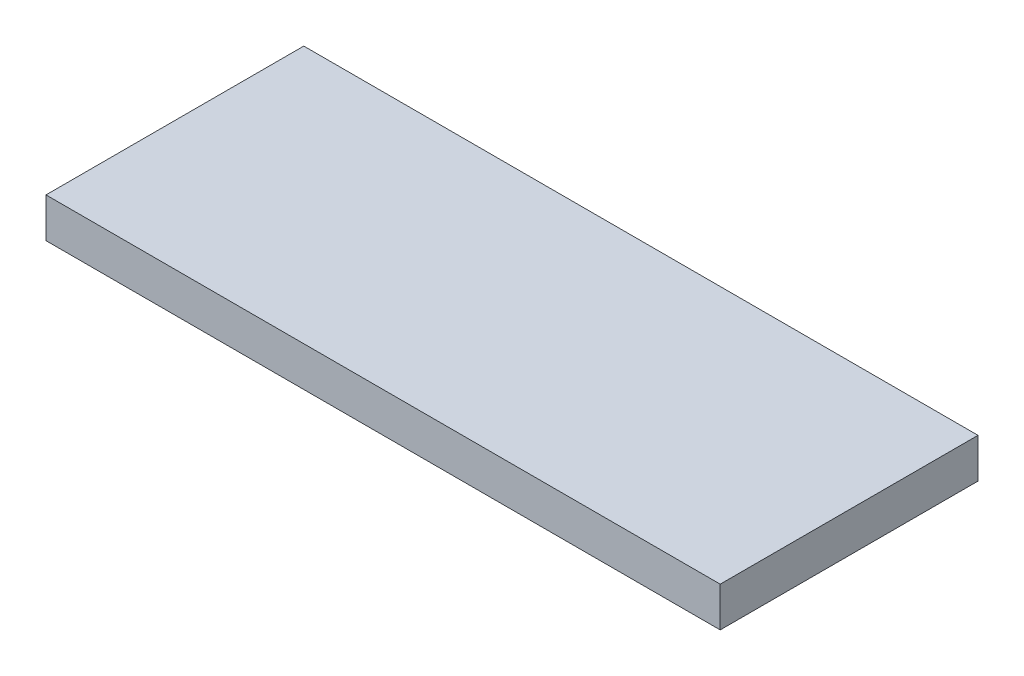
ISO-10303-21;
HEADER;
FILE_DESCRIPTION(('STEP AP214'),'2;1');
FILE_NAME('part.step','',(''),(''),'','','');
FILE_SCHEMA(('AUTOMOTIVE_DESIGN { 1 0 10303 214 1 1 1 1 }'));
ENDSEC;
DATA;
#1=APPLICATION_CONTEXT('core data for automotive mechanical design processes');
#2=APPLICATION_PROTOCOL_DEFINITION('international standard','automotive_design',2000,#1);
#3=PRODUCT_CONTEXT('',#1,'mechanical');
#4=PRODUCT('Part','Part','',(#3));
#5=PRODUCT_RELATED_PRODUCT_CATEGORY('part','',(#4));
#6=PRODUCT_DEFINITION_FORMATION('','',#4);
#7=PRODUCT_DEFINITION_CONTEXT('part definition',#1,'design');
#8=PRODUCT_DEFINITION('design','',#6,#7);
#9=PRODUCT_DEFINITION_SHAPE('','',#8);
#10=(LENGTH_UNIT() NAMED_UNIT(*) SI_UNIT(.MILLI.,.METRE.));
#11=(NAMED_UNIT(*) PLANE_ANGLE_UNIT() SI_UNIT($,.RADIAN.));
#12=(NAMED_UNIT(*) SI_UNIT($,.STERADIAN.) SOLID_ANGLE_UNIT());
#13=UNCERTAINTY_MEASURE_WITH_UNIT(LENGTH_MEASURE(1.E-05),#10,'distance_accuracy_value','');
#14=(GEOMETRIC_REPRESENTATION_CONTEXT(3) GLOBAL_UNCERTAINTY_ASSIGNED_CONTEXT((#13)) GLOBAL_UNIT_ASSIGNED_CONTEXT((#10,
#11,#12)) REPRESENTATION_CONTEXT('',''));
#15=CARTESIAN_POINT('',(0.,0.,0.));
#16=DIRECTION('',(0.,0.,1.));
#17=DIRECTION('',(1.,0.,0.));
#18=AXIS2_PLACEMENT_3D('',#15,#16,#17);
#19=CARTESIAN_POINT('',(85.,10.,-32.5));
#20=DIRECTION('',(-1.,0.,0.));
#21=DIRECTION('',(0.,0.,1.));
#22=AXIS2_PLACEMENT_3D('',#19,#20,#21);
#23=PLANE('',#22);
#24=DIRECTION('',(0.,0.,-1.));
#25=VECTOR('',#24,1.);
#26=CARTESIAN_POINT('',(85.,0.,-32.5));
#27=LINE('',#26,#25);
#28=CARTESIAN_POINT('',(85.,0.,32.5));
#29=VERTEX_POINT('',#28);
#30=CARTESIAN_POINT('',(85.,0.,-32.5));
#31=VERTEX_POINT('',#30);
#32=EDGE_CURVE('E280',#29,#31,#27,.T.);
#33=ORIENTED_EDGE('',*,*,#32,.T.);
#34=DIRECTION('',(0.,-1.,0.));
#35=VECTOR('',#34,1.);
#36=CARTESIAN_POINT('',(85.,10.,-32.5));
#37=LINE('',#36,#35);
#38=CARTESIAN_POINT('',(85.,10.,-32.5));
#39=VERTEX_POINT('',#38);
#40=EDGE_CURVE('E11',#39,#31,#37,.T.);
#41=ORIENTED_EDGE('',*,*,#40,.F.);
#42=DIRECTION('',(0.,0.,-1.));
#43=VECTOR('',#42,1.);
#44=CARTESIAN_POINT('',(85.,10.,-32.5));
#45=LINE('',#44,#43);
#46=CARTESIAN_POINT('',(85.,10.,32.5));
#47=VERTEX_POINT('',#46);
#48=EDGE_CURVE('E501',#47,#39,#45,.T.);
#49=ORIENTED_EDGE('',*,*,#48,.F.);
#50=DIRECTION('',(0.,-1.,0.));
#51=VECTOR('',#50,1.);
#52=CARTESIAN_POINT('',(85.,10.,32.5));
#53=LINE('',#52,#51);
#54=EDGE_CURVE('E511',#47,#29,#53,.T.);
#55=ORIENTED_EDGE('',*,*,#54,.T.);
#56=EDGE_LOOP('',(#33,#41,#49,#55));
#57=FACE_BOUND('',#56,.T.);
#58=ADVANCED_FACE('F50',(#57),#23,.F.);
#59=CARTESIAN_POINT('',(-85.,10.,-32.5));
#60=DIRECTION('',(0.,0.,1.));
#61=DIRECTION('',(1.,0.,0.));
#62=AXIS2_PLACEMENT_3D('',#59,#60,#61);
#63=PLANE('',#62);
#64=DIRECTION('',(1.,0.,0.));
#65=VECTOR('',#64,1.);
#66=CARTESIAN_POINT('',(-73.1490114378295,5.88872544908327,-32.5));
#67=LINE('',#66,#65);
#68=CARTESIAN_POINT('',(-73.1490114378295,5.88872544908327,-32.5));
#69=VERTEX_POINT('',#68);
#70=CARTESIAN_POINT('',(-62.2916738910824,5.88872544908327,-32.5));
#71=VERTEX_POINT('',#70);
#72=EDGE_CURVE('E268',#69,#71,#67,.T.);
#73=ORIENTED_EDGE('',*,*,#72,.F.);
#74=DIRECTION('',(0.,1.,0.));
#75=VECTOR('',#74,1.);
#76=CARTESIAN_POINT('',(-73.1490114378295,2.57631738397402,-32.5));
#77=LINE('',#76,#75);
#78=CARTESIAN_POINT('',(-73.1490114378295,2.57631738397402,-32.5));
#79=VERTEX_POINT('',#78);
#80=EDGE_CURVE('E65',#79,#69,#77,.T.);
#81=ORIENTED_EDGE('',*,*,#80,.F.);
#82=DIRECTION('',(-1.,0.,0.));
#83=VECTOR('',#82,1.);
#84=CARTESIAN_POINT('',(-73.1490114378295,2.57631738397402,-32.5));
#85=LINE('',#84,#83);
#86=CARTESIAN_POINT('',(-62.2916738910824,2.57631738397402,-32.5));
#87=VERTEX_POINT('',#86);
#88=EDGE_CURVE('E251',#87,#79,#85,.T.);
#89=ORIENTED_EDGE('',*,*,#88,.F.);
#90=DIRECTION('',(0.,-1.,0.));
#91=VECTOR('',#90,1.);
#92=CARTESIAN_POINT('',(-62.2916738910824,2.57631738397402,-32.5));
#93=LINE('',#92,#91);
#94=EDGE_CURVE('E260',#71,#87,#93,.T.);
#95=ORIENTED_EDGE('',*,*,#94,.F.);
#96=EDGE_LOOP('',(#73,#81,#89,#95));
#97=FACE_BOUND('',#96,.T.);
#98=DIRECTION('',(1.,0.,0.));
#99=VECTOR('',#98,1.);
#100=CARTESIAN_POINT('',(-57.5070844637024,5.88872544908327,-32.5));
#101=LINE('',#100,#99);
#102=CARTESIAN_POINT('',(-57.5070844637024,5.88872544908327,-32.5));
#103=VERTEX_POINT('',#102);
#104=CARTESIAN_POINT('',(-44.9935428844007,5.88872544908327,-32.5));
#105=VERTEX_POINT('',#104);
#106=EDGE_CURVE('E308',#103,#105,#101,.T.);
#107=ORIENTED_EDGE('',*,*,#106,.F.);
#108=DIRECTION('',(0.,1.,0.));
#109=VECTOR('',#108,1.);
#110=CARTESIAN_POINT('',(-57.5070844637024,2.57631738397402,-32.5));
#111=LINE('',#110,#109);
#112=CARTESIAN_POINT('',(-57.5070844637024,2.57631738397402,-32.5));
#113=VERTEX_POINT('',#112);
#114=EDGE_CURVE('E68',#113,#103,#111,.T.);
#115=ORIENTED_EDGE('',*,*,#114,.F.);
#116=DIRECTION('',(-1.,0.,0.));
#117=VECTOR('',#116,1.);
#118=CARTESIAN_POINT('',(-57.5070844637024,2.57631738397402,-32.5));
#119=LINE('',#118,#117);
#120=CARTESIAN_POINT('',(-44.9935428844007,2.57631738397402,-32.5));
#121=VERTEX_POINT('',#120);
#122=EDGE_CURVE('E300',#121,#113,#119,.T.);
#123=ORIENTED_EDGE('',*,*,#122,.F.);
#124=DIRECTION('',(0.,-1.,0.));
#125=VECTOR('',#124,1.);
#126=CARTESIAN_POINT('',(-44.9935428844007,2.57631738397402,-32.5));
#127=LINE('',#126,#125);
#128=EDGE_CURVE('E303',#105,#121,#127,.T.);
#129=ORIENTED_EDGE('',*,*,#128,.F.);
#130=EDGE_LOOP('',(#107,#115,#123,#129));
#131=FACE_BOUND('',#130,.T.);
#132=DIRECTION('',(1.,0.,0.));
#133=VECTOR('',#132,1.);
#134=CARTESIAN_POINT('',(-30.8237972725445,7.9129748222056,-32.5));
#135=LINE('',#134,#133);
#136=CARTESIAN_POINT('',(-30.8237972725445,7.9129748222056,-32.5));
#137=VERTEX_POINT('',#136);
#138=CARTESIAN_POINT('',(-17.5741650121075,7.9129748222056,-32.5));
#139=VERTEX_POINT('',#138);
#140=EDGE_CURVE('E349',#137,#139,#135,.T.);
#141=ORIENTED_EDGE('',*,*,#140,.F.);
#142=DIRECTION('',(0.,1.,0.));
#143=VECTOR('',#142,1.);
#144=CARTESIAN_POINT('',(-30.8237972725445,2.57631738397402,-32.5));
#145=LINE('',#144,#143);
#146=CARTESIAN_POINT('',(-30.8237972725445,2.57631738397402,-32.5));
#147=VERTEX_POINT('',#146);
#148=EDGE_CURVE('E297',#147,#137,#145,.T.);
#149=ORIENTED_EDGE('',*,*,#148,.F.);
#150=DIRECTION('',(-1.,0.,0.));
#151=VECTOR('',#150,1.);
#152=CARTESIAN_POINT('',(-30.8237972725445,2.57631738397402,-32.5));
#153=LINE('',#152,#151);
#154=CARTESIAN_POINT('',(-17.5741650121075,2.57631738397402,-32.5));
#155=VERTEX_POINT('',#154);
#156=EDGE_CURVE('E342',#155,#147,#153,.T.);
#157=ORIENTED_EDGE('',*,*,#156,.F.);
#158=DIRECTION('',(0.,-1.,0.));
#159=VECTOR('',#158,1.);
#160=CARTESIAN_POINT('',(-17.5741650121075,2.57631738397402,-32.5));
#161=LINE('',#160,#159);
#162=EDGE_CURVE('E341',#139,#155,#161,.T.);
#163=ORIENTED_EDGE('',*,*,#162,.F.);
#164=EDGE_LOOP('',(#141,#149,#157,#163));
#165=FACE_BOUND('',#164,.T.);
#166=DIRECTION('',(1.,0.,0.));
#167=VECTOR('',#166,1.);
#168=CARTESIAN_POINT('',(-9.10912217905047,7.9129748222056,-32.5));
#169=LINE('',#168,#167);
#170=CARTESIAN_POINT('',(-9.10912217905047,7.9129748222056,-32.5));
#171=VERTEX_POINT('',#170);
#172=CARTESIAN_POINT('',(5.24464610308967,7.9129748222056,-32.5));
#173=VERTEX_POINT('',#172);
#174=EDGE_CURVE('E395',#171,#173,#169,.T.);
#175=ORIENTED_EDGE('',*,*,#174,.F.);
#176=DIRECTION('',(0.,1.,0.));
#177=VECTOR('',#176,1.);
#178=CARTESIAN_POINT('',(-9.10912217905047,2.57631738397402,-32.5));
#179=LINE('',#178,#177);
#180=CARTESIAN_POINT('',(-9.10912217905047,2.57631738397402,-32.5));
#181=VERTEX_POINT('',#180);
#182=EDGE_CURVE('E338',#181,#171,#179,.T.);
#183=ORIENTED_EDGE('',*,*,#182,.F.);
#184=DIRECTION('',(-1.,0.,0.));
#185=VECTOR('',#184,1.);
#186=CARTESIAN_POINT('',(-9.10912217905047,2.57631738397402,-32.5));
#187=LINE('',#186,#185);
#188=CARTESIAN_POINT('',(5.24464610308967,2.57631738397402,-32.5));
#189=VERTEX_POINT('',#188);
#190=EDGE_CURVE('E383',#189,#181,#187,.T.);
#191=ORIENTED_EDGE('',*,*,#190,.F.);
#192=DIRECTION('',(0.,-1.,0.));
#193=VECTOR('',#192,1.);
#194=CARTESIAN_POINT('',(5.24464610308967,2.57631738397402,-32.5));
#195=LINE('',#194,#193);
#196=EDGE_CURVE('E389',#173,#189,#195,.T.);
#197=ORIENTED_EDGE('',*,*,#196,.F.);
#198=EDGE_LOOP('',(#175,#183,#191,#197));
#199=FACE_BOUND('',#198,.T.);
#200=DIRECTION('',(1.,0.,0.));
#201=VECTOR('',#200,1.);
#202=CARTESIAN_POINT('',(14.8138249578497,7.9129748222056,-32.5));
#203=LINE('',#202,#201);
#204=CARTESIAN_POINT('',(14.8138249578497,7.9129748222056,-32.5));
#205=VERTEX_POINT('',#204);
#206=CARTESIAN_POINT('',(29.1675932399899,7.9129748222056,-32.5));
#207=VERTEX_POINT('',#206);
#208=EDGE_CURVE('E436',#205,#207,#203,.T.);
#209=ORIENTED_EDGE('',*,*,#208,.F.);
#210=DIRECTION('',(0.,1.,0.));
#211=VECTOR('',#210,1.);
#212=CARTESIAN_POINT('',(14.8138249578497,2.57631738397402,-32.5));
#213=LINE('',#212,#211);
#214=CARTESIAN_POINT('',(14.8138249578497,2.57631738397402,-32.5));
#215=VERTEX_POINT('',#214);
#216=EDGE_CURVE('E384',#215,#205,#213,.T.);
#217=ORIENTED_EDGE('',*,*,#216,.F.);
#218=DIRECTION('',(-1.,0.,0.));
#219=VECTOR('',#218,1.);
#220=CARTESIAN_POINT('',(14.8138249578497,2.57631738397402,-32.5));
#221=LINE('',#220,#219);
#222=CARTESIAN_POINT('',(29.1675932399899,2.57631738397402,-32.5));
#223=VERTEX_POINT('',#222);
#224=EDGE_CURVE('E429',#223,#215,#221,.T.);
#225=ORIENTED_EDGE('',*,*,#224,.F.);
#226=DIRECTION('',(0.,-1.,0.));
#227=VECTOR('',#226,1.);
#228=CARTESIAN_POINT('',(29.1675932399899,2.57631738397402,-32.5));
#229=LINE('',#228,#227);
#230=EDGE_CURVE('E433',#207,#223,#229,.T.);
#231=ORIENTED_EDGE('',*,*,#230,.F.);
#232=EDGE_LOOP('',(#209,#217,#225,#231));
#233=FACE_BOUND('',#232,.T.);
#234=DIRECTION('',(1.,0.,0.));
#235=VECTOR('',#234,1.);
#236=CARTESIAN_POINT('',(43.7053841924138,5.24464610308981,-32.5));
#237=LINE('',#236,#235);
#238=CARTESIAN_POINT('',(43.7053841924138,5.24464610308981,-32.5));
#239=VERTEX_POINT('',#238);
#240=CARTESIAN_POINT('',(70.5726940538556,5.24464610308981,-32.5));
#241=VERTEX_POINT('',#240);
#242=EDGE_CURVE('E483',#239,#241,#237,.T.);
#243=ORIENTED_EDGE('',*,*,#242,.F.);
#244=DIRECTION('',(0.,1.,0.));
#245=VECTOR('',#244,1.);
#246=CARTESIAN_POINT('',(43.7053841924138,2.57631738397402,-32.5));
#247=LINE('',#246,#245);
#248=CARTESIAN_POINT('',(43.7053841924138,2.57631738397402,-32.5));
#249=VERTEX_POINT('',#248);
#250=EDGE_CURVE('E426',#249,#239,#247,.T.);
#251=ORIENTED_EDGE('',*,*,#250,.F.);
#252=DIRECTION('',(-1.,0.,0.));
#253=VECTOR('',#252,1.);
#254=CARTESIAN_POINT('',(43.7053841924138,2.57631738397402,-32.5));
#255=LINE('',#254,#253);
#256=CARTESIAN_POINT('',(70.5726940538556,2.57631738397402,-32.5));
#257=VERTEX_POINT('',#256);
#258=EDGE_CURVE('E475',#257,#249,#255,.T.);
#259=ORIENTED_EDGE('',*,*,#258,.F.);
#260=DIRECTION('',(0.,-1.,0.));
#261=VECTOR('',#260,1.);
#262=CARTESIAN_POINT('',(70.5726940538556,2.57631738397402,-32.5));
#263=LINE('',#262,#261);
#264=EDGE_CURVE('E477',#241,#257,#263,.T.);
#265=ORIENTED_EDGE('',*,*,#264,.F.);
#266=EDGE_LOOP('',(#243,#251,#259,#265));
#267=FACE_BOUND('',#266,.T.);
#268=DIRECTION('',(-1.,0.,0.));
#269=VECTOR('',#268,1.);
#270=CARTESIAN_POINT('',(-85.,0.,-32.5));
#271=LINE('',#270,#269);
#272=CARTESIAN_POINT('',(-85.,0.,-32.5));
#273=VERTEX_POINT('',#272);
#274=EDGE_CURVE('E519',#31,#273,#271,.T.);
#275=ORIENTED_EDGE('',*,*,#274,.T.);
#276=DIRECTION('',(0.,-1.,0.));
#277=VECTOR('',#276,1.);
#278=CARTESIAN_POINT('',(-85.,10.,-32.5));
#279=LINE('',#278,#277);
#280=CARTESIAN_POINT('',(-85.,10.,-32.5));
#281=VERTEX_POINT('',#280);
#282=EDGE_CURVE('E54',#281,#273,#279,.T.);
#283=ORIENTED_EDGE('',*,*,#282,.F.);
#284=DIRECTION('',(-1.,0.,0.));
#285=VECTOR('',#284,1.);
#286=CARTESIAN_POINT('',(-85.,10.,-32.5));
#287=LINE('',#286,#285);
#288=EDGE_CURVE('E504',#39,#281,#287,.T.);
#289=ORIENTED_EDGE('',*,*,#288,.F.);
#290=ORIENTED_EDGE('',*,*,#40,.T.);
#291=EDGE_LOOP('',(#275,#283,#289,#290));
#292=FACE_BOUND('',#291,.T.);
#293=ADVANCED_FACE('F553',(#97,#131,#165,#199,#233,#267,#292),#63,.F.);
#294=CARTESIAN_POINT('',(-85.,10.,-32.5));
#295=DIRECTION('',(1.,0.,0.));
#296=DIRECTION('',(0.,0.,-1.));
#297=AXIS2_PLACEMENT_3D('',#294,#295,#296);
#298=PLANE('',#297);
#299=DIRECTION('',(0.,0.,1.));
#300=VECTOR('',#299,1.);
#301=CARTESIAN_POINT('',(-85.,0.,-32.5));
#302=LINE('',#301,#300);
#303=CARTESIAN_POINT('',(-85.,0.,32.5));
#304=VERTEX_POINT('',#303);
#305=EDGE_CURVE('E525',#273,#304,#302,.T.);
#306=ORIENTED_EDGE('',*,*,#305,.T.);
#307=DIRECTION('',(0.,-1.,0.));
#308=VECTOR('',#307,1.);
#309=CARTESIAN_POINT('',(-85.,10.,32.5));
#310=LINE('',#309,#308);
#311=CARTESIAN_POINT('',(-85.,10.,32.5));
#312=VERTEX_POINT('',#311);
#313=EDGE_CURVE('E529',#312,#304,#310,.T.);
#314=ORIENTED_EDGE('',*,*,#313,.F.);
#315=DIRECTION('',(0.,0.,1.));
#316=VECTOR('',#315,1.);
#317=CARTESIAN_POINT('',(-85.,10.,-32.5));
#318=LINE('',#317,#316);
#319=EDGE_CURVE('E506',#281,#312,#318,.T.);
#320=ORIENTED_EDGE('',*,*,#319,.F.);
#321=ORIENTED_EDGE('',*,*,#282,.T.);
#322=EDGE_LOOP('',(#306,#314,#320,#321));
#323=FACE_BOUND('',#322,.T.);
#324=ADVANCED_FACE('F537',(#323),#298,.F.);
#325=CARTESIAN_POINT('',(-85.,10.,32.5));
#326=DIRECTION('',(0.,0.,-1.));
#327=DIRECTION('',(-1.,0.,0.));
#328=AXIS2_PLACEMENT_3D('',#325,#326,#327);
#329=PLANE('',#328);
#330=DIRECTION('',(1.,0.,0.));
#331=VECTOR('',#330,1.);
#332=CARTESIAN_POINT('',(-85.,0.,32.5));
#333=LINE('',#332,#331);
#334=EDGE_CURVE('E507',#304,#29,#333,.T.);
#335=ORIENTED_EDGE('',*,*,#334,.T.);
#336=ORIENTED_EDGE('',*,*,#54,.F.);
#337=DIRECTION('',(1.,0.,0.));
#338=VECTOR('',#337,1.);
#339=CARTESIAN_POINT('',(-85.,10.,32.5));
#340=LINE('',#339,#338);
#341=EDGE_CURVE('E515',#312,#47,#340,.T.);
#342=ORIENTED_EDGE('',*,*,#341,.F.);
#343=ORIENTED_EDGE('',*,*,#313,.T.);
#344=EDGE_LOOP('',(#335,#336,#342,#343));
#345=FACE_BOUND('',#344,.T.);
#346=ADVANCED_FACE('F547',(#345),#329,.F.);
#347=CARTESIAN_POINT('',(0.,10.,0.));
#348=DIRECTION('',(0.,1.,0.));
#349=DIRECTION('',(0.,0.,1.));
#350=AXIS2_PLACEMENT_3D('',#347,#348,#349);
#351=PLANE('',#350);
#352=ORIENTED_EDGE('',*,*,#48,.T.);
#353=ORIENTED_EDGE('',*,*,#288,.T.);
#354=ORIENTED_EDGE('',*,*,#319,.T.);
#355=ORIENTED_EDGE('',*,*,#341,.T.);
#356=EDGE_LOOP('',(#352,#353,#354,#355));
#357=FACE_BOUND('',#356,.T.);
#358=ADVANCED_FACE('F551',(#357),#351,.T.);
#359=CARTESIAN_POINT('',(0.,0.,0.));
#360=DIRECTION('',(0.,1.,0.));
#361=DIRECTION('',(0.,0.,1.));
#362=AXIS2_PLACEMENT_3D('',#359,#360,#361);
#363=PLANE('',#362);
#364=ORIENTED_EDGE('',*,*,#32,.F.);
#365=ORIENTED_EDGE('',*,*,#334,.F.);
#366=ORIENTED_EDGE('',*,*,#305,.F.);
#367=ORIENTED_EDGE('',*,*,#274,.F.);
#368=EDGE_LOOP('',(#364,#365,#366,#367));
#369=FACE_BOUND('',#368,.T.);
#370=ADVANCED_FACE('F544',(#369),#363,.F.);
#371=CARTESIAN_POINT('',(43.7053841924138,2.57631738397402,-27.5));
#372=DIRECTION('',(-1.,0.,0.));
#373=DIRECTION('',(0.,0.,1.));
#374=AXIS2_PLACEMENT_3D('',#371,#372,#373);
#375=PLANE('',#374);
#376=ORIENTED_EDGE('',*,*,#250,.T.);
#377=DIRECTION('',(0.,0.,-1.));
#378=VECTOR('',#377,1.);
#379=CARTESIAN_POINT('',(43.7053841924138,5.24464610308981,-27.5));
#380=LINE('',#379,#378);
#381=CARTESIAN_POINT('',(43.7053841924138,5.24464610308981,-27.5));
#382=VERTEX_POINT('',#381);
#383=EDGE_CURVE('E457',#382,#239,#380,.T.);
#384=ORIENTED_EDGE('',*,*,#383,.F.);
#385=DIRECTION('',(0.,1.,0.));
#386=VECTOR('',#385,1.);
#387=CARTESIAN_POINT('',(43.7053841924138,2.57631738397402,-27.5));
#388=LINE('',#387,#386);
#389=CARTESIAN_POINT('',(43.7053841924138,2.57631738397402,-27.5));
#390=VERTEX_POINT('',#389);
#391=EDGE_CURVE('E480',#390,#382,#388,.T.);
#392=ORIENTED_EDGE('',*,*,#391,.F.);
#393=DIRECTION('',(0.,0.,-1.));
#394=VECTOR('',#393,1.);
#395=CARTESIAN_POINT('',(43.7053841924138,2.57631738397402,-27.5));
#396=LINE('',#395,#394);
#397=EDGE_CURVE('E469',#390,#249,#396,.T.);
#398=ORIENTED_EDGE('',*,*,#397,.T.);
#399=EDGE_LOOP('',(#376,#384,#392,#398));
#400=FACE_BOUND('',#399,.T.);
#401=ADVANCED_FACE('F566',(#400),#375,.F.);
#402=CARTESIAN_POINT('',(43.7053841924138,2.57631738397402,-27.5));
#403=DIRECTION('',(0.,-1.,0.));
#404=DIRECTION('',(0.,0.,-1.));
#405=AXIS2_PLACEMENT_3D('',#402,#403,#404);
#406=PLANE('',#405);
#407=ORIENTED_EDGE('',*,*,#258,.T.);
#408=ORIENTED_EDGE('',*,*,#397,.F.);
#409=DIRECTION('',(-1.,0.,0.));
#410=VECTOR('',#409,1.);
#411=CARTESIAN_POINT('',(43.7053841924138,2.57631738397402,-27.5));
#412=LINE('',#411,#410);
#413=CARTESIAN_POINT('',(70.5726940538556,2.57631738397402,-27.5));
#414=VERTEX_POINT('',#413);
#415=EDGE_CURVE('E465',#414,#390,#412,.T.);
#416=ORIENTED_EDGE('',*,*,#415,.F.);
#417=DIRECTION('',(0.,0.,-1.));
#418=VECTOR('',#417,1.);
#419=CARTESIAN_POINT('',(70.5726940538556,2.57631738397402,-27.5));
#420=LINE('',#419,#418);
#421=EDGE_CURVE('E467',#414,#257,#420,.T.);
#422=ORIENTED_EDGE('',*,*,#421,.T.);
#423=EDGE_LOOP('',(#407,#408,#416,#422));
#424=FACE_BOUND('',#423,.T.);
#425=ADVANCED_FACE('F579',(#424),#406,.F.);
#426=CARTESIAN_POINT('',(70.5726940538556,2.57631738397402,-27.5));
#427=DIRECTION('',(1.,0.,0.));
#428=DIRECTION('',(0.,0.,-1.));
#429=AXIS2_PLACEMENT_3D('',#426,#427,#428);
#430=PLANE('',#429);
#431=ORIENTED_EDGE('',*,*,#264,.T.);
#432=ORIENTED_EDGE('',*,*,#421,.F.);
#433=DIRECTION('',(0.,-1.,0.));
#434=VECTOR('',#433,1.);
#435=CARTESIAN_POINT('',(70.5726940538556,2.57631738397402,-27.5));
#436=LINE('',#435,#434);
#437=CARTESIAN_POINT('',(70.5726940538556,5.24464610308981,-27.5));
#438=VERTEX_POINT('',#437);
#439=EDGE_CURVE('E487',#438,#414,#436,.T.);
#440=ORIENTED_EDGE('',*,*,#439,.F.);
#441=DIRECTION('',(0.,0.,-1.));
#442=VECTOR('',#441,1.);
#443=CARTESIAN_POINT('',(70.5726940538556,5.24464610308981,-27.5));
#444=LINE('',#443,#442);
#445=EDGE_CURVE('E464',#438,#241,#444,.T.);
#446=ORIENTED_EDGE('',*,*,#445,.T.);
#447=EDGE_LOOP('',(#431,#432,#440,#446));
#448=FACE_BOUND('',#447,.T.);
#449=ADVANCED_FACE('F585',(#448),#430,.F.);
#450=CARTESIAN_POINT('',(43.7053841924138,5.24464610308981,-27.5));
#451=DIRECTION('',(0.,1.,0.));
#452=DIRECTION('',(0.,0.,1.));
#453=AXIS2_PLACEMENT_3D('',#450,#451,#452);
#454=PLANE('',#453);
#455=ORIENTED_EDGE('',*,*,#242,.T.);
#456=ORIENTED_EDGE('',*,*,#445,.F.);
#457=DIRECTION('',(1.,0.,0.));
#458=VECTOR('',#457,1.);
#459=CARTESIAN_POINT('',(43.7053841924138,5.24464610308981,-27.5));
#460=LINE('',#459,#458);
#461=EDGE_CURVE('E492',#382,#438,#460,.T.);
#462=ORIENTED_EDGE('',*,*,#461,.F.);
#463=ORIENTED_EDGE('',*,*,#383,.T.);
#464=EDGE_LOOP('',(#455,#456,#462,#463));
#465=FACE_BOUND('',#464,.T.);
#466=ADVANCED_FACE('F580',(#465),#454,.F.);
#467=CARTESIAN_POINT('',(0.,0.,-27.5));
#468=DIRECTION('',(0.,0.,-1.));
#469=DIRECTION('',(-1.,0.,0.));
#470=AXIS2_PLACEMENT_3D('',#467,#468,#469);
#471=PLANE('',#470);
#472=ORIENTED_EDGE('',*,*,#391,.T.);
#473=ORIENTED_EDGE('',*,*,#461,.T.);
#474=ORIENTED_EDGE('',*,*,#439,.T.);
#475=ORIENTED_EDGE('',*,*,#415,.T.);
#476=EDGE_LOOP('',(#472,#473,#474,#475));
#477=FACE_BOUND('',#476,.T.);
#478=ADVANCED_FACE('F571',(#477),#471,.T.);
#479=CARTESIAN_POINT('',(14.8138249578497,2.57631738397402,-27.5));
#480=DIRECTION('',(-1.,0.,0.));
#481=DIRECTION('',(0.,0.,1.));
#482=AXIS2_PLACEMENT_3D('',#479,#480,#481);
#483=PLANE('',#482);
#484=ORIENTED_EDGE('',*,*,#216,.T.);
#485=DIRECTION('',(0.,0.,-1.));
#486=VECTOR('',#485,1.);
#487=CARTESIAN_POINT('',(14.8138249578497,7.9129748222056,-27.5));
#488=LINE('',#487,#486);
#489=CARTESIAN_POINT('',(14.8138249578497,7.9129748222056,-27.5));
#490=VERTEX_POINT('',#489);
#491=EDGE_CURVE('E413',#490,#205,#488,.T.);
#492=ORIENTED_EDGE('',*,*,#491,.F.);
#493=DIRECTION('',(0.,1.,0.));
#494=VECTOR('',#493,1.);
#495=CARTESIAN_POINT('',(14.8138249578497,2.57631738397402,-27.5));
#496=LINE('',#495,#494);
#497=CARTESIAN_POINT('',(14.8138249578497,2.57631738397402,-27.5));
#498=VERTEX_POINT('',#497);
#499=EDGE_CURVE('E434',#498,#490,#496,.T.);
#500=ORIENTED_EDGE('',*,*,#499,.F.);
#501=DIRECTION('',(0.,0.,-1.));
#502=VECTOR('',#501,1.);
#503=CARTESIAN_POINT('',(14.8138249578497,2.57631738397402,-27.5));
#504=LINE('',#503,#502);
#505=EDGE_CURVE('E421',#498,#215,#504,.T.);
#506=ORIENTED_EDGE('',*,*,#505,.T.);
#507=EDGE_LOOP('',(#484,#492,#500,#506));
#508=FACE_BOUND('',#507,.T.);
#509=ADVANCED_FACE('F578',(#508),#483,.F.);
#510=CARTESIAN_POINT('',(14.8138249578497,2.57631738397402,-27.5));
#511=DIRECTION('',(0.,-1.,0.));
#512=DIRECTION('',(0.,0.,-1.));
#513=AXIS2_PLACEMENT_3D('',#510,#511,#512);
#514=PLANE('',#513);
#515=ORIENTED_EDGE('',*,*,#224,.T.);
#516=ORIENTED_EDGE('',*,*,#505,.F.);
#517=DIRECTION('',(-1.,0.,0.));
#518=VECTOR('',#517,1.);
#519=CARTESIAN_POINT('',(14.8138249578497,2.57631738397402,-27.5));
#520=LINE('',#519,#518);
#521=CARTESIAN_POINT('',(29.1675932399899,2.57631738397402,-27.5));
#522=VERTEX_POINT('',#521);
#523=EDGE_CURVE('E419',#522,#498,#520,.T.);
#524=ORIENTED_EDGE('',*,*,#523,.F.);
#525=DIRECTION('',(0.,0.,-1.));
#526=VECTOR('',#525,1.);
#527=CARTESIAN_POINT('',(29.1675932399899,2.57631738397402,-27.5));
#528=LINE('',#527,#526);
#529=EDGE_CURVE('E425',#522,#223,#528,.T.);
#530=ORIENTED_EDGE('',*,*,#529,.T.);
#531=EDGE_LOOP('',(#515,#516,#524,#530));
#532=FACE_BOUND('',#531,.T.);
#533=ADVANCED_FACE('F599',(#532),#514,.F.);
#534=CARTESIAN_POINT('',(29.1675932399899,2.57631738397402,-27.5));
#535=DIRECTION('',(1.,0.,0.));
#536=DIRECTION('',(0.,0.,-1.));
#537=AXIS2_PLACEMENT_3D('',#534,#535,#536);
#538=PLANE('',#537);
#539=ORIENTED_EDGE('',*,*,#230,.T.);
#540=ORIENTED_EDGE('',*,*,#529,.F.);
#541=DIRECTION('',(0.,-1.,0.));
#542=VECTOR('',#541,1.);
#543=CARTESIAN_POINT('',(29.1675932399899,2.57631738397402,-27.5));
#544=LINE('',#543,#542);
#545=CARTESIAN_POINT('',(29.1675932399899,7.9129748222056,-27.5));
#546=VERTEX_POINT('',#545);
#547=EDGE_CURVE('E450',#546,#522,#544,.T.);
#548=ORIENTED_EDGE('',*,*,#547,.F.);
#549=DIRECTION('',(0.,0.,-1.));
#550=VECTOR('',#549,1.);
#551=CARTESIAN_POINT('',(29.1675932399899,7.9129748222056,-27.5));
#552=LINE('',#551,#550);
#553=EDGE_CURVE('E416',#546,#207,#552,.T.);
#554=ORIENTED_EDGE('',*,*,#553,.T.);
#555=EDGE_LOOP('',(#539,#540,#548,#554));
#556=FACE_BOUND('',#555,.T.);
#557=ADVANCED_FACE('F602',(#556),#538,.F.);
#558=CARTESIAN_POINT('',(14.8138249578497,7.9129748222056,-27.5));
#559=DIRECTION('',(0.,1.,0.));
#560=DIRECTION('',(0.,0.,1.));
#561=AXIS2_PLACEMENT_3D('',#558,#559,#560);
#562=PLANE('',#561);
#563=ORIENTED_EDGE('',*,*,#208,.T.);
#564=ORIENTED_EDGE('',*,*,#553,.F.);
#565=DIRECTION('',(1.,0.,0.));
#566=VECTOR('',#565,1.);
#567=CARTESIAN_POINT('',(14.8138249578497,7.9129748222056,-27.5));
#568=LINE('',#567,#566);
#569=EDGE_CURVE('E451',#490,#546,#568,.T.);
#570=ORIENTED_EDGE('',*,*,#569,.F.);
#571=ORIENTED_EDGE('',*,*,#491,.T.);
#572=EDGE_LOOP('',(#563,#564,#570,#571));
#573=FACE_BOUND('',#572,.T.);
#574=ADVANCED_FACE('F597',(#573),#562,.F.);
#575=CARTESIAN_POINT('',(0.,0.,-27.5));
#576=DIRECTION('',(0.,0.,-1.));
#577=DIRECTION('',(-1.,0.,0.));
#578=AXIS2_PLACEMENT_3D('',#575,#576,#577);
#579=PLANE('',#578);
#580=ORIENTED_EDGE('',*,*,#499,.T.);
#581=ORIENTED_EDGE('',*,*,#569,.T.);
#582=ORIENTED_EDGE('',*,*,#547,.T.);
#583=ORIENTED_EDGE('',*,*,#523,.T.);
#584=EDGE_LOOP('',(#580,#581,#582,#583));
#585=FACE_BOUND('',#584,.T.);
#586=ADVANCED_FACE('F595',(#585),#579,.T.);
#587=CARTESIAN_POINT('',(-9.10912217905047,2.57631738397402,-27.5));
#588=DIRECTION('',(-1.,0.,0.));
#589=DIRECTION('',(0.,0.,1.));
#590=AXIS2_PLACEMENT_3D('',#587,#588,#589);
#591=PLANE('',#590);
#592=ORIENTED_EDGE('',*,*,#182,.T.);
#593=DIRECTION('',(0.,0.,-1.));
#594=VECTOR('',#593,1.);
#595=CARTESIAN_POINT('',(-9.10912217905047,7.9129748222056,-27.5));
#596=LINE('',#595,#594);
#597=CARTESIAN_POINT('',(-9.10912217905047,7.9129748222056,-27.5));
#598=VERTEX_POINT('',#597);
#599=EDGE_CURVE('E369',#598,#171,#596,.T.);
#600=ORIENTED_EDGE('',*,*,#599,.F.);
#601=DIRECTION('',(0.,1.,0.));
#602=VECTOR('',#601,1.);
#603=CARTESIAN_POINT('',(-9.10912217905047,2.57631738397402,-27.5));
#604=LINE('',#603,#602);
#605=CARTESIAN_POINT('',(-9.10912217905047,2.57631738397402,-27.5));
#606=VERTEX_POINT('',#605);
#607=EDGE_CURVE('E386',#606,#598,#604,.T.);
#608=ORIENTED_EDGE('',*,*,#607,.F.);
#609=DIRECTION('',(0.,0.,-1.));
#610=VECTOR('',#609,1.);
#611=CARTESIAN_POINT('',(-9.10912217905047,2.57631738397402,-27.5));
#612=LINE('',#611,#610);
#613=EDGE_CURVE('E382',#606,#181,#612,.T.);
#614=ORIENTED_EDGE('',*,*,#613,.T.);
#615=EDGE_LOOP('',(#592,#600,#608,#614));
#616=FACE_BOUND('',#615,.T.);
#617=ADVANCED_FACE('F594',(#616),#591,.F.);
#618=CARTESIAN_POINT('',(-9.10912217905047,2.57631738397402,-27.5));
#619=DIRECTION('',(0.,-1.,0.));
#620=DIRECTION('',(0.,0.,-1.));
#621=AXIS2_PLACEMENT_3D('',#618,#619,#620);
#622=PLANE('',#621);
#623=ORIENTED_EDGE('',*,*,#190,.T.);
#624=ORIENTED_EDGE('',*,*,#613,.F.);
#625=DIRECTION('',(-1.,0.,0.));
#626=VECTOR('',#625,1.);
#627=CARTESIAN_POINT('',(-9.10912217905047,2.57631738397402,-27.5));
#628=LINE('',#627,#626);
#629=CARTESIAN_POINT('',(5.24464610308967,2.57631738397402,-27.5));
#630=VERTEX_POINT('',#629);
#631=EDGE_CURVE('E371',#630,#606,#628,.T.);
#632=ORIENTED_EDGE('',*,*,#631,.F.);
#633=DIRECTION('',(0.,0.,-1.));
#634=VECTOR('',#633,1.);
#635=CARTESIAN_POINT('',(5.24464610308967,2.57631738397402,-27.5));
#636=LINE('',#635,#634);
#637=EDGE_CURVE('E378',#630,#189,#636,.T.);
#638=ORIENTED_EDGE('',*,*,#637,.T.);
#639=EDGE_LOOP('',(#623,#624,#632,#638));
#640=FACE_BOUND('',#639,.T.);
#641=ADVANCED_FACE('F616',(#640),#622,.F.);
#642=CARTESIAN_POINT('',(5.24464610308967,2.57631738397402,-27.5));
#643=DIRECTION('',(1.,0.,0.));
#644=DIRECTION('',(0.,0.,-1.));
#645=AXIS2_PLACEMENT_3D('',#642,#643,#644);
#646=PLANE('',#645);
#647=ORIENTED_EDGE('',*,*,#196,.T.);
#648=ORIENTED_EDGE('',*,*,#637,.F.);
#649=DIRECTION('',(0.,-1.,0.));
#650=VECTOR('',#649,1.);
#651=CARTESIAN_POINT('',(5.24464610308967,2.57631738397402,-27.5));
#652=LINE('',#651,#650);
#653=CARTESIAN_POINT('',(5.24464610308967,7.9129748222056,-27.5));
#654=VERTEX_POINT('',#653);
#655=EDGE_CURVE('E403',#654,#630,#652,.T.);
#656=ORIENTED_EDGE('',*,*,#655,.F.);
#657=DIRECTION('',(0.,0.,-1.));
#658=VECTOR('',#657,1.);
#659=CARTESIAN_POINT('',(5.24464610308967,7.9129748222056,-27.5));
#660=LINE('',#659,#658);
#661=EDGE_CURVE('E373',#654,#173,#660,.T.);
#662=ORIENTED_EDGE('',*,*,#661,.T.);
#663=EDGE_LOOP('',(#647,#648,#656,#662));
#664=FACE_BOUND('',#663,.T.);
#665=ADVANCED_FACE('F623',(#664),#646,.F.);
#666=CARTESIAN_POINT('',(-9.10912217905047,7.9129748222056,-27.5));
#667=DIRECTION('',(0.,1.,0.));
#668=DIRECTION('',(0.,0.,1.));
#669=AXIS2_PLACEMENT_3D('',#666,#667,#668);
#670=PLANE('',#669);
#671=ORIENTED_EDGE('',*,*,#174,.T.);
#672=ORIENTED_EDGE('',*,*,#661,.F.);
#673=DIRECTION('',(1.,0.,0.));
#674=VECTOR('',#673,1.);
#675=CARTESIAN_POINT('',(-9.10912217905047,7.9129748222056,-27.5));
#676=LINE('',#675,#674);
#677=EDGE_CURVE('E410',#598,#654,#676,.T.);
#678=ORIENTED_EDGE('',*,*,#677,.F.);
#679=ORIENTED_EDGE('',*,*,#599,.T.);
#680=EDGE_LOOP('',(#671,#672,#678,#679));
#681=FACE_BOUND('',#680,.T.);
#682=ADVANCED_FACE('F618',(#681),#670,.F.);
#683=CARTESIAN_POINT('',(0.,0.,-27.5));
#684=DIRECTION('',(0.,0.,-1.));
#685=DIRECTION('',(-1.,0.,0.));
#686=AXIS2_PLACEMENT_3D('',#683,#684,#685);
#687=PLANE('',#686);
#688=ORIENTED_EDGE('',*,*,#607,.T.);
#689=ORIENTED_EDGE('',*,*,#677,.T.);
#690=ORIENTED_EDGE('',*,*,#655,.T.);
#691=ORIENTED_EDGE('',*,*,#631,.T.);
#692=EDGE_LOOP('',(#688,#689,#690,#691));
#693=FACE_BOUND('',#692,.T.);
#694=ADVANCED_FACE('F615',(#693),#687,.T.);
#695=CARTESIAN_POINT('',(-30.8237972725445,2.57631738397402,-27.5));
#696=DIRECTION('',(-1.,0.,0.));
#697=DIRECTION('',(0.,0.,1.));
#698=AXIS2_PLACEMENT_3D('',#695,#696,#697);
#699=PLANE('',#698);
#700=ORIENTED_EDGE('',*,*,#148,.T.);
#701=DIRECTION('',(0.,0.,-1.));
#702=VECTOR('',#701,1.);
#703=CARTESIAN_POINT('',(-30.8237972725445,7.9129748222056,-27.5));
#704=LINE('',#703,#702);
#705=CARTESIAN_POINT('',(-30.8237972725445,7.9129748222056,-27.5));
#706=VERTEX_POINT('',#705);
#707=EDGE_CURVE('E327',#706,#137,#704,.T.);
#708=ORIENTED_EDGE('',*,*,#707,.F.);
#709=DIRECTION('',(0.,1.,0.));
#710=VECTOR('',#709,1.);
#711=CARTESIAN_POINT('',(-30.8237972725445,2.57631738397402,-27.5));
#712=LINE('',#711,#710);
#713=CARTESIAN_POINT('',(-30.8237972725445,2.57631738397402,-27.5));
#714=VERTEX_POINT('',#713);
#715=EDGE_CURVE('E348',#714,#706,#712,.T.);
#716=ORIENTED_EDGE('',*,*,#715,.F.);
#717=DIRECTION('',(0.,0.,-1.));
#718=VECTOR('',#717,1.);
#719=CARTESIAN_POINT('',(-30.8237972725445,2.57631738397402,-27.5));
#720=LINE('',#719,#718);
#721=EDGE_CURVE('E340',#714,#147,#720,.T.);
#722=ORIENTED_EDGE('',*,*,#721,.T.);
#723=EDGE_LOOP('',(#700,#708,#716,#722));
#724=FACE_BOUND('',#723,.T.);
#725=ADVANCED_FACE('F611',(#724),#699,.F.);
#726=CARTESIAN_POINT('',(-30.8237972725445,2.57631738397402,-27.5));
#727=DIRECTION('',(0.,-1.,0.));
#728=DIRECTION('',(0.,0.,-1.));
#729=AXIS2_PLACEMENT_3D('',#726,#727,#728);
#730=PLANE('',#729);
#731=ORIENTED_EDGE('',*,*,#156,.T.);
#732=ORIENTED_EDGE('',*,*,#721,.F.);
#733=DIRECTION('',(-1.,0.,0.));
#734=VECTOR('',#733,1.);
#735=CARTESIAN_POINT('',(-30.8237972725445,2.57631738397402,-27.5));
#736=LINE('',#735,#734);
#737=CARTESIAN_POINT('',(-17.5741650121075,2.57631738397402,-27.5));
#738=VERTEX_POINT('',#737);
#739=EDGE_CURVE('E328',#738,#714,#736,.T.);
#740=ORIENTED_EDGE('',*,*,#739,.F.);
#741=DIRECTION('',(0.,0.,-1.));
#742=VECTOR('',#741,1.);
#743=CARTESIAN_POINT('',(-17.5741650121075,2.57631738397402,-27.5));
#744=LINE('',#743,#742);
#745=EDGE_CURVE('E334',#738,#155,#744,.T.);
#746=ORIENTED_EDGE('',*,*,#745,.T.);
#747=EDGE_LOOP('',(#731,#732,#740,#746));
#748=FACE_BOUND('',#747,.T.);
#749=ADVANCED_FACE('F637',(#748),#730,.F.);
#750=CARTESIAN_POINT('',(-17.5741650121075,2.57631738397402,-27.5));
#751=DIRECTION('',(1.,0.,0.));
#752=DIRECTION('',(0.,0.,-1.));
#753=AXIS2_PLACEMENT_3D('',#750,#751,#752);
#754=PLANE('',#753);
#755=ORIENTED_EDGE('',*,*,#162,.T.);
#756=ORIENTED_EDGE('',*,*,#745,.F.);
#757=DIRECTION('',(0.,-1.,0.));
#758=VECTOR('',#757,1.);
#759=CARTESIAN_POINT('',(-17.5741650121075,2.57631738397402,-27.5));
#760=LINE('',#759,#758);
#761=CARTESIAN_POINT('',(-17.5741650121075,7.9129748222056,-27.5));
#762=VERTEX_POINT('',#761);
#763=EDGE_CURVE('E357',#762,#738,#760,.T.);
#764=ORIENTED_EDGE('',*,*,#763,.F.);
#765=DIRECTION('',(0.,0.,-1.));
#766=VECTOR('',#765,1.);
#767=CARTESIAN_POINT('',(-17.5741650121075,7.9129748222056,-27.5));
#768=LINE('',#767,#766);
#769=EDGE_CURVE('E332',#762,#139,#768,.T.);
#770=ORIENTED_EDGE('',*,*,#769,.T.);
#771=EDGE_LOOP('',(#755,#756,#764,#770));
#772=FACE_BOUND('',#771,.T.);
#773=ADVANCED_FACE('F642',(#772),#754,.F.);
#774=CARTESIAN_POINT('',(-30.8237972725445,7.9129748222056,-27.5));
#775=DIRECTION('',(0.,1.,0.));
#776=DIRECTION('',(0.,0.,1.));
#777=AXIS2_PLACEMENT_3D('',#774,#775,#776);
#778=PLANE('',#777);
#779=ORIENTED_EDGE('',*,*,#140,.T.);
#780=ORIENTED_EDGE('',*,*,#769,.F.);
#781=DIRECTION('',(1.,0.,0.));
#782=VECTOR('',#781,1.);
#783=CARTESIAN_POINT('',(-30.8237972725445,7.9129748222056,-27.5));
#784=LINE('',#783,#782);
#785=EDGE_CURVE('E363',#706,#762,#784,.T.);
#786=ORIENTED_EDGE('',*,*,#785,.F.);
#787=ORIENTED_EDGE('',*,*,#707,.T.);
#788=EDGE_LOOP('',(#779,#780,#786,#787));
#789=FACE_BOUND('',#788,.T.);
#790=ADVANCED_FACE('F636',(#789),#778,.F.);
#791=CARTESIAN_POINT('',(0.,0.,-27.5));
#792=DIRECTION('',(0.,0.,-1.));
#793=DIRECTION('',(-1.,0.,0.));
#794=AXIS2_PLACEMENT_3D('',#791,#792,#793);
#795=PLANE('',#794);
#796=ORIENTED_EDGE('',*,*,#715,.T.);
#797=ORIENTED_EDGE('',*,*,#785,.T.);
#798=ORIENTED_EDGE('',*,*,#763,.T.);
#799=ORIENTED_EDGE('',*,*,#739,.T.);
#800=EDGE_LOOP('',(#796,#797,#798,#799));
#801=FACE_BOUND('',#800,.T.);
#802=ADVANCED_FACE('F635',(#801),#795,.T.);
#803=CARTESIAN_POINT('',(-57.5070844637024,2.57631738397402,-27.5));
#804=DIRECTION('',(-1.,0.,0.));
#805=DIRECTION('',(0.,0.,1.));
#806=AXIS2_PLACEMENT_3D('',#803,#804,#805);
#807=PLANE('',#806);
#808=ORIENTED_EDGE('',*,*,#114,.T.);
#809=DIRECTION('',(0.,0.,-1.));
#810=VECTOR('',#809,1.);
#811=CARTESIAN_POINT('',(-57.5070844637024,5.88872544908327,-27.5));
#812=LINE('',#811,#810);
#813=CARTESIAN_POINT('',(-57.5070844637024,5.88872544908327,-27.5));
#814=VERTEX_POINT('',#813);
#815=EDGE_CURVE('E284',#814,#103,#812,.T.);
#816=ORIENTED_EDGE('',*,*,#815,.F.);
#817=DIRECTION('',(0.,1.,0.));
#818=VECTOR('',#817,1.);
#819=CARTESIAN_POINT('',(-57.5070844637024,2.57631738397402,-27.5));
#820=LINE('',#819,#818);
#821=CARTESIAN_POINT('',(-57.5070844637024,2.57631738397402,-27.5));
#822=VERTEX_POINT('',#821);
#823=EDGE_CURVE('E302',#822,#814,#820,.T.);
#824=ORIENTED_EDGE('',*,*,#823,.F.);
#825=DIRECTION('',(0.,0.,-1.));
#826=VECTOR('',#825,1.);
#827=CARTESIAN_POINT('',(-57.5070844637024,2.57631738397402,-27.5));
#828=LINE('',#827,#826);
#829=EDGE_CURVE('E291',#822,#113,#828,.T.);
#830=ORIENTED_EDGE('',*,*,#829,.T.);
#831=EDGE_LOOP('',(#808,#816,#824,#830));
#832=FACE_BOUND('',#831,.T.);
#833=ADVANCED_FACE('F634',(#832),#807,.F.);
#834=CARTESIAN_POINT('',(-57.5070844637024,2.57631738397402,-27.5));
#835=DIRECTION('',(0.,-1.,0.));
#836=DIRECTION('',(0.,0.,-1.));
#837=AXIS2_PLACEMENT_3D('',#834,#835,#836);
#838=PLANE('',#837);
#839=ORIENTED_EDGE('',*,*,#122,.T.);
#840=ORIENTED_EDGE('',*,*,#829,.F.);
#841=DIRECTION('',(-1.,0.,0.));
#842=VECTOR('',#841,1.);
#843=CARTESIAN_POINT('',(-57.5070844637024,2.57631738397402,-27.5));
#844=LINE('',#843,#842);
#845=CARTESIAN_POINT('',(-44.9935428844007,2.57631738397402,-27.5));
#846=VERTEX_POINT('',#845);
#847=EDGE_CURVE('E287',#846,#822,#844,.T.);
#848=ORIENTED_EDGE('',*,*,#847,.F.);
#849=DIRECTION('',(0.,0.,-1.));
#850=VECTOR('',#849,1.);
#851=CARTESIAN_POINT('',(-44.9935428844007,2.57631738397402,-27.5));
#852=LINE('',#851,#850);
#853=EDGE_CURVE('E286',#846,#121,#852,.T.);
#854=ORIENTED_EDGE('',*,*,#853,.T.);
#855=EDGE_LOOP('',(#839,#840,#848,#854));
#856=FACE_BOUND('',#855,.T.);
#857=ADVANCED_FACE('F660',(#856),#838,.F.);
#858=CARTESIAN_POINT('',(-44.9935428844007,2.57631738397402,-27.5));
#859=DIRECTION('',(1.,0.,0.));
#860=DIRECTION('',(0.,0.,-1.));
#861=AXIS2_PLACEMENT_3D('',#858,#859,#860);
#862=PLANE('',#861);
#863=ORIENTED_EDGE('',*,*,#128,.T.);
#864=ORIENTED_EDGE('',*,*,#853,.F.);
#865=DIRECTION('',(0.,-1.,0.));
#866=VECTOR('',#865,1.);
#867=CARTESIAN_POINT('',(-44.9935428844007,2.57631738397402,-27.5));
#868=LINE('',#867,#866);
#869=CARTESIAN_POINT('',(-44.9935428844007,5.88872544908327,-27.5));
#870=VERTEX_POINT('',#869);
#871=EDGE_CURVE('E314',#870,#846,#868,.T.);
#872=ORIENTED_EDGE('',*,*,#871,.F.);
#873=DIRECTION('',(0.,0.,-1.));
#874=VECTOR('',#873,1.);
#875=CARTESIAN_POINT('',(-44.9935428844007,5.88872544908327,-27.5));
#876=LINE('',#875,#874);
#877=EDGE_CURVE('E290',#870,#105,#876,.T.);
#878=ORIENTED_EDGE('',*,*,#877,.T.);
#879=EDGE_LOOP('',(#863,#864,#872,#878));
#880=FACE_BOUND('',#879,.T.);
#881=ADVANCED_FACE('F656',(#880),#862,.F.);
#882=CARTESIAN_POINT('',(-57.5070844637024,5.88872544908327,-27.5));
#883=DIRECTION('',(0.,1.,0.));
#884=DIRECTION('',(0.,0.,1.));
#885=AXIS2_PLACEMENT_3D('',#882,#883,#884);
#886=PLANE('',#885);
#887=ORIENTED_EDGE('',*,*,#106,.T.);
#888=ORIENTED_EDGE('',*,*,#877,.F.);
#889=DIRECTION('',(1.,0.,0.));
#890=VECTOR('',#889,1.);
#891=CARTESIAN_POINT('',(-57.5070844637024,5.88872544908327,-27.5));
#892=LINE('',#891,#890);
#893=EDGE_CURVE('E317',#814,#870,#892,.T.);
#894=ORIENTED_EDGE('',*,*,#893,.F.);
#895=ORIENTED_EDGE('',*,*,#815,.T.);
#896=EDGE_LOOP('',(#887,#888,#894,#895));
#897=FACE_BOUND('',#896,.T.);
#898=ADVANCED_FACE('F653',(#897),#886,.F.);
#899=CARTESIAN_POINT('',(0.,0.,-27.5));
#900=DIRECTION('',(0.,0.,-1.));
#901=DIRECTION('',(-1.,0.,0.));
#902=AXIS2_PLACEMENT_3D('',#899,#900,#901);
#903=PLANE('',#902);
#904=ORIENTED_EDGE('',*,*,#823,.T.);
#905=ORIENTED_EDGE('',*,*,#893,.T.);
#906=ORIENTED_EDGE('',*,*,#871,.T.);
#907=ORIENTED_EDGE('',*,*,#847,.T.);
#908=EDGE_LOOP('',(#904,#905,#906,#907));
#909=FACE_BOUND('',#908,.T.);
#910=ADVANCED_FACE('F655',(#909),#903,.T.);
#911=CARTESIAN_POINT('',(-73.1490114378295,2.57631738397402,-27.5));
#912=DIRECTION('',(-1.,0.,0.));
#913=DIRECTION('',(0.,0.,1.));
#914=AXIS2_PLACEMENT_3D('',#911,#912,#913);
#915=PLANE('',#914);
#916=ORIENTED_EDGE('',*,*,#80,.T.);
#917=DIRECTION('',(0.,0.,-1.));
#918=VECTOR('',#917,1.);
#919=CARTESIAN_POINT('',(-73.1490114378295,5.88872544908327,-27.5));
#920=LINE('',#919,#918);
#921=CARTESIAN_POINT('',(-73.1490114378295,5.88872544908327,-27.5));
#922=VERTEX_POINT('',#921);
#923=EDGE_CURVE('E229',#922,#69,#920,.T.);
#924=ORIENTED_EDGE('',*,*,#923,.F.);
#925=DIRECTION('',(0.,1.,0.));
#926=VECTOR('',#925,1.);
#927=CARTESIAN_POINT('',(-73.1490114378295,2.57631738397402,-27.5));
#928=LINE('',#927,#926);
#929=CARTESIAN_POINT('',(-73.1490114378295,2.57631738397402,-27.5));
#930=VERTEX_POINT('',#929);
#931=EDGE_CURVE('E233',#930,#922,#928,.T.);
#932=ORIENTED_EDGE('',*,*,#931,.F.);
#933=DIRECTION('',(0.,0.,-1.));
#934=VECTOR('',#933,1.);
#935=CARTESIAN_POINT('',(-73.1490114378295,2.57631738397402,-27.5));
#936=LINE('',#935,#934);
#937=EDGE_CURVE('E272',#930,#79,#936,.T.);
#938=ORIENTED_EDGE('',*,*,#937,.T.);
#939=EDGE_LOOP('',(#916,#924,#932,#938));
#940=FACE_BOUND('',#939,.T.);
#941=ADVANCED_FACE('F235',(#940),#915,.F.);
#942=CARTESIAN_POINT('',(-73.1490114378295,2.57631738397402,-27.5));
#943=DIRECTION('',(0.,-1.,0.));
#944=DIRECTION('',(0.,0.,-1.));
#945=AXIS2_PLACEMENT_3D('',#942,#943,#944);
#946=PLANE('',#945);
#947=ORIENTED_EDGE('',*,*,#88,.T.);
#948=ORIENTED_EDGE('',*,*,#937,.F.);
#949=DIRECTION('',(-1.,0.,0.));
#950=VECTOR('',#949,1.);
#951=CARTESIAN_POINT('',(-73.1490114378295,2.57631738397402,-27.5));
#952=LINE('',#951,#950);
#953=CARTESIAN_POINT('',(-62.2916738910824,2.57631738397402,-27.5));
#954=VERTEX_POINT('',#953);
#955=EDGE_CURVE('E242',#954,#930,#952,.T.);
#956=ORIENTED_EDGE('',*,*,#955,.F.);
#957=DIRECTION('',(0.,0.,-1.));
#958=VECTOR('',#957,1.);
#959=CARTESIAN_POINT('',(-62.2916738910824,2.57631738397402,-27.5));
#960=LINE('',#959,#958);
#961=EDGE_CURVE('E277',#954,#87,#960,.T.);
#962=ORIENTED_EDGE('',*,*,#961,.T.);
#963=EDGE_LOOP('',(#947,#948,#956,#962));
#964=FACE_BOUND('',#963,.T.);
#965=ADVANCED_FACE('F675',(#964),#946,.F.);
#966=CARTESIAN_POINT('',(-62.2916738910824,2.57631738397402,-27.5));
#967=DIRECTION('',(1.,0.,0.));
#968=DIRECTION('',(0.,0.,-1.));
#969=AXIS2_PLACEMENT_3D('',#966,#967,#968);
#970=PLANE('',#969);
#971=ORIENTED_EDGE('',*,*,#94,.T.);
#972=ORIENTED_EDGE('',*,*,#961,.F.);
#973=DIRECTION('',(0.,-1.,0.));
#974=VECTOR('',#973,1.);
#975=CARTESIAN_POINT('',(-62.2916738910824,2.57631738397402,-27.5));
#976=LINE('',#975,#974);
#977=CARTESIAN_POINT('',(-62.2916738910824,5.88872544908327,-27.5));
#978=VERTEX_POINT('',#977);
#979=EDGE_CURVE('E248',#978,#954,#976,.T.);
#980=ORIENTED_EDGE('',*,*,#979,.F.);
#981=DIRECTION('',(0.,0.,-1.));
#982=VECTOR('',#981,1.);
#983=CARTESIAN_POINT('',(-62.2916738910824,5.88872544908327,-27.5));
#984=LINE('',#983,#982);
#985=EDGE_CURVE('E238',#978,#71,#984,.T.);
#986=ORIENTED_EDGE('',*,*,#985,.T.);
#987=EDGE_LOOP('',(#971,#972,#980,#986));
#988=FACE_BOUND('',#987,.T.);
#989=ADVANCED_FACE('F674',(#988),#970,.F.);
#990=CARTESIAN_POINT('',(-73.1490114378295,5.88872544908327,-27.5));
#991=DIRECTION('',(0.,1.,0.));
#992=DIRECTION('',(0.,0.,1.));
#993=AXIS2_PLACEMENT_3D('',#990,#991,#992);
#994=PLANE('',#993);
#995=ORIENTED_EDGE('',*,*,#72,.T.);
#996=ORIENTED_EDGE('',*,*,#985,.F.);
#997=DIRECTION('',(1.,0.,0.));
#998=VECTOR('',#997,1.);
#999=CARTESIAN_POINT('',(-73.1490114378295,5.88872544908327,-27.5));
#1000=LINE('',#999,#998);
#1001=EDGE_CURVE('E244',#922,#978,#1000,.T.);
#1002=ORIENTED_EDGE('',*,*,#1001,.F.);
#1003=ORIENTED_EDGE('',*,*,#923,.T.);
#1004=EDGE_LOOP('',(#995,#996,#1002,#1003));
#1005=FACE_BOUND('',#1004,.T.);
#1006=ADVANCED_FACE('F241',(#1005),#994,.F.);
#1007=CARTESIAN_POINT('',(0.,0.,-27.5));
#1008=DIRECTION('',(0.,0.,-1.));
#1009=DIRECTION('',(-1.,0.,0.));
#1010=AXIS2_PLACEMENT_3D('',#1007,#1008,#1009);
#1011=PLANE('',#1010);
#1012=ORIENTED_EDGE('',*,*,#931,.T.);
#1013=ORIENTED_EDGE('',*,*,#1001,.T.);
#1014=ORIENTED_EDGE('',*,*,#979,.T.);
#1015=ORIENTED_EDGE('',*,*,#955,.T.);
#1016=EDGE_LOOP('',(#1012,#1013,#1014,#1015));
#1017=FACE_BOUND('',#1016,.T.);
#1018=ADVANCED_FACE('F255',(#1017),#1011,.T.);
#1019=CLOSED_SHELL('',(#58,#293,#324,#346,#358,#370,#401,#425,#449,#466,#478,#509,#533,#557,
#574,#586,#617,#641,#665,#682,#694,#725,#749,#773,#790,#802,#833,#857,#881,#898,#910,#941,#965,
#989,#1006,#1018));
#1020=MANIFOLD_SOLID_BREP('B2',#1019);
#1021=ADVANCED_BREP_SHAPE_REPRESENTATION('',(#18,#1020),#14);
#1022=SHAPE_DEFINITION_REPRESENTATION(#9,#1021);
ENDSEC;
END-ISO-10303-21;
